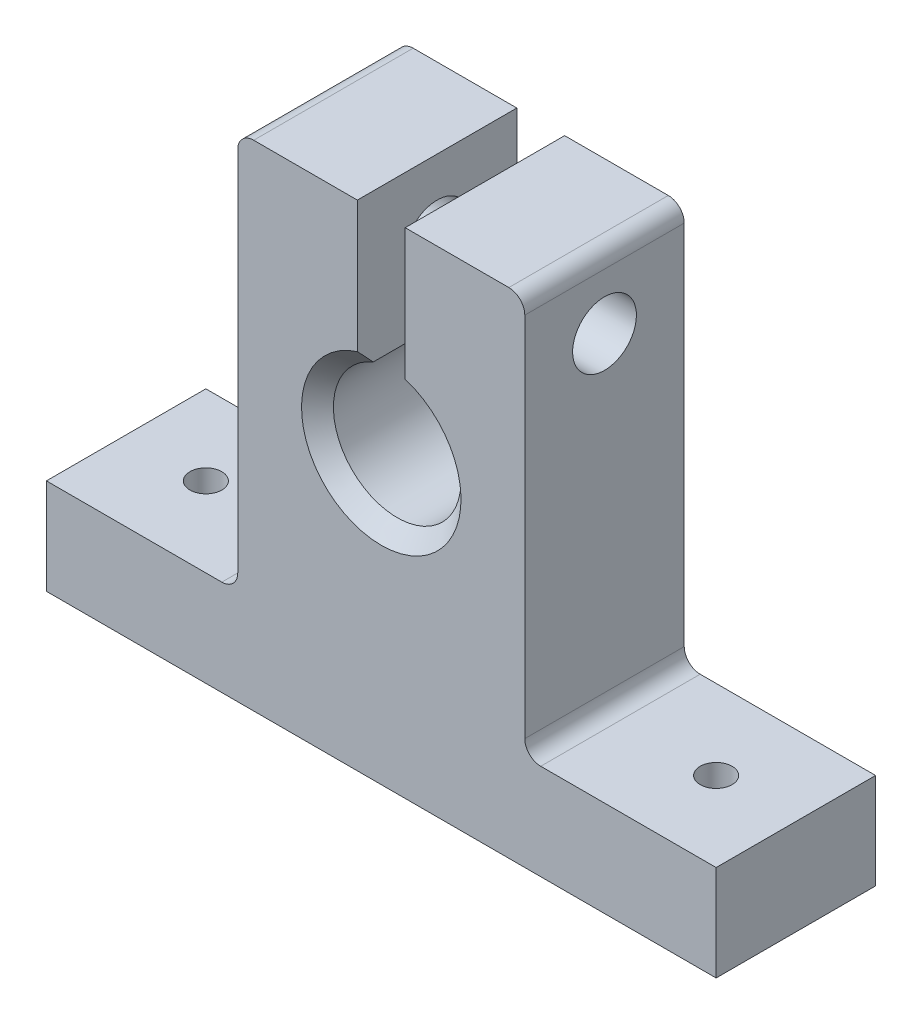
ISO-10303-21;
HEADER;
FILE_DESCRIPTION(('STEP AP214'),'2;1');
FILE_NAME('part.step','',(''),(''),'','','');
FILE_SCHEMA(('AUTOMOTIVE_DESIGN { 1 0 10303 214 1 1 1 1 }'));
ENDSEC;
DATA;
#1=APPLICATION_CONTEXT('core data for automotive mechanical design processes');
#2=APPLICATION_PROTOCOL_DEFINITION('international standard','automotive_design',2000,#1);
#3=PRODUCT_CONTEXT('',#1,'mechanical');
#4=PRODUCT('Part','Part','',(#3));
#5=PRODUCT_RELATED_PRODUCT_CATEGORY('part','',(#4));
#6=PRODUCT_DEFINITION_FORMATION('','',#4);
#7=PRODUCT_DEFINITION_CONTEXT('part definition',#1,'design');
#8=PRODUCT_DEFINITION('design','',#6,#7);
#9=PRODUCT_DEFINITION_SHAPE('','',#8);
#10=(LENGTH_UNIT() NAMED_UNIT(*) SI_UNIT(.MILLI.,.METRE.));
#11=(NAMED_UNIT(*) PLANE_ANGLE_UNIT() SI_UNIT($,.RADIAN.));
#12=(NAMED_UNIT(*) SI_UNIT($,.STERADIAN.) SOLID_ANGLE_UNIT());
#13=UNCERTAINTY_MEASURE_WITH_UNIT(LENGTH_MEASURE(1.E-05),#10,'distance_accuracy_value','');
#14=(GEOMETRIC_REPRESENTATION_CONTEXT(3) GLOBAL_UNCERTAINTY_ASSIGNED_CONTEXT((#13)) GLOBAL_UNIT_ASSIGNED_CONTEXT((#10,
#11,#12)) REPRESENTATION_CONTEXT('',''));
#15=CARTESIAN_POINT('',(0.,0.,0.));
#16=DIRECTION('',(0.,0.,1.));
#17=DIRECTION('',(1.,0.,0.));
#18=AXIS2_PLACEMENT_3D('',#15,#16,#17);
#19=CARTESIAN_POINT('',(0.,28.,0.));
#20=DIRECTION('',(0.,1.,0.));
#21=DIRECTION('',(0.,0.,1.));
#22=AXIS2_PLACEMENT_3D('',#19,#20,#21);
#23=PLANE('',#22);
#24=DIRECTION('',(0.,0.,1.));
#25=VECTOR('',#24,1.);
#26=CARTESIAN_POINT('',(8.,28.,0.));
#27=LINE('',#26,#25);
#28=CARTESIAN_POINT('',(8.,28.,12.));
#29=VERTEX_POINT('',#28);
#30=CARTESIAN_POINT('',(8.,28.,2.));
#31=VERTEX_POINT('',#30);
#32=EDGE_CURVE('E178',#29,#31,#27,.F.);
#33=ORIENTED_EDGE('',*,*,#32,.T.);
#34=DIRECTION('',(-1.,0.,0.));
#35=VECTOR('',#34,1.);
#36=CARTESIAN_POINT('',(0.,28.,2.));
#37=LINE('',#36,#35);
#38=CARTESIAN_POINT('',(1.5,28.,2.));
#39=VERTEX_POINT('',#38);
#40=EDGE_CURVE('E164',#31,#39,#37,.T.);
#41=ORIENTED_EDGE('',*,*,#40,.T.);
#42=DIRECTION('',(0.,0.,1.));
#43=VECTOR('',#42,1.);
#44=CARTESIAN_POINT('',(1.5,28.,0.));
#45=LINE('',#44,#43);
#46=CARTESIAN_POINT('',(1.5,28.,12.));
#47=VERTEX_POINT('',#46);
#48=EDGE_CURVE('E175',#39,#47,#45,.T.);
#49=ORIENTED_EDGE('',*,*,#48,.T.);
#50=DIRECTION('',(1.,0.,0.));
#51=VECTOR('',#50,1.);
#52=CARTESIAN_POINT('',(0.,28.,12.));
#53=LINE('',#52,#51);
#54=EDGE_CURVE('E401',#47,#29,#53,.T.);
#55=ORIENTED_EDGE('',*,*,#54,.T.);
#56=EDGE_LOOP('',(#33,#41,#49,#55));
#57=FACE_BOUND('',#56,.T.);
#58=ADVANCED_FACE('F33',(#57),#23,.T.);
#59=CARTESIAN_POINT('',(-21.,3.,14.));
#60=DIRECTION('',(0.,-1.,0.));
#61=DIRECTION('',(0.,0.,-1.));
#62=AXIS2_PLACEMENT_3D('',#59,#60,#61);
#63=PLANE('',#62);
#64=CARTESIAN_POINT('',(-16.,3.,7.));
#65=DIRECTION('',(0.,-1.,0.));
#66=DIRECTION('',(0.,0.,-1.));
#67=AXIS2_PLACEMENT_3D('',#64,#65,#66);
#68=CIRCLE('',#67,1.);
#69=CARTESIAN_POINT('',(-16.,3.,6.));
#70=VERTEX_POINT('',#69);
#71=EDGE_CURVE('E205',#70,#70,#68,.T.);
#72=ORIENTED_EDGE('',*,*,#71,.T.);
#73=EDGE_LOOP('',(#72));
#74=FACE_BOUND('',#73,.T.);
#75=DIRECTION('',(1.,0.,0.));
#76=VECTOR('',#75,1.);
#77=CARTESIAN_POINT('',(-21.,3.,2.));
#78=LINE('',#77,#76);
#79=CARTESIAN_POINT('',(-21.,3.,2.));
#80=VERTEX_POINT('',#79);
#81=CARTESIAN_POINT('',(-10.,3.,2.));
#82=VERTEX_POINT('',#81);
#83=EDGE_CURVE('E399',#80,#82,#78,.T.);
#84=ORIENTED_EDGE('',*,*,#83,.F.);
#85=DIRECTION('',(0.,0.,-1.));
#86=VECTOR('',#85,1.);
#87=CARTESIAN_POINT('',(-21.,3.,14.));
#88=LINE('',#87,#86);
#89=CARTESIAN_POINT('',(-21.,3.,12.));
#90=VERTEX_POINT('',#89);
#91=EDGE_CURVE('E214',#90,#80,#88,.T.);
#92=ORIENTED_EDGE('',*,*,#91,.F.);
#93=DIRECTION('',(-1.,0.,0.));
#94=VECTOR('',#93,1.);
#95=CARTESIAN_POINT('',(-21.,3.,12.));
#96=LINE('',#95,#94);
#97=CARTESIAN_POINT('',(-10.,3.,12.));
#98=VERTEX_POINT('',#97);
#99=EDGE_CURVE('E361',#98,#90,#96,.T.);
#100=ORIENTED_EDGE('',*,*,#99,.F.);
#101=DIRECTION('',(0.,0.,1.));
#102=VECTOR('',#101,1.);
#103=CARTESIAN_POINT('',(-10.,3.,14.));
#104=LINE('',#103,#102);
#105=EDGE_CURVE('E222',#98,#82,#104,.F.);
#106=ORIENTED_EDGE('',*,*,#105,.T.);
#107=EDGE_LOOP('',(#84,#92,#100,#106));
#108=FACE_BOUND('',#107,.T.);
#109=ADVANCED_FACE('F292',(#74,#108),#63,.F.);
#110=CARTESIAN_POINT('',(21.,-3.,14.));
#111=DIRECTION('',(-1.,0.,0.));
#112=DIRECTION('',(0.,0.,1.));
#113=AXIS2_PLACEMENT_3D('',#110,#111,#112);
#114=PLANE('',#113);
#115=DIRECTION('',(0.,-1.,0.));
#116=VECTOR('',#115,1.);
#117=CARTESIAN_POINT('',(21.,-3.,2.));
#118=LINE('',#117,#116);
#119=CARTESIAN_POINT('',(21.,3.,2.));
#120=VERTEX_POINT('',#119);
#121=CARTESIAN_POINT('',(21.,-3.,2.));
#122=VERTEX_POINT('',#121);
#123=EDGE_CURVE('E391',#120,#122,#118,.T.);
#124=ORIENTED_EDGE('',*,*,#123,.F.);
#125=DIRECTION('',(0.,0.,-1.));
#126=VECTOR('',#125,1.);
#127=CARTESIAN_POINT('',(21.,3.,14.));
#128=LINE('',#127,#126);
#129=CARTESIAN_POINT('',(21.,3.,12.));
#130=VERTEX_POINT('',#129);
#131=EDGE_CURVE('E217',#130,#120,#128,.T.);
#132=ORIENTED_EDGE('',*,*,#131,.F.);
#133=DIRECTION('',(0.,1.,0.));
#134=VECTOR('',#133,1.);
#135=CARTESIAN_POINT('',(21.,-3.,12.));
#136=LINE('',#135,#134);
#137=CARTESIAN_POINT('',(21.,-3.,12.));
#138=VERTEX_POINT('',#137);
#139=EDGE_CURVE('E353',#138,#130,#136,.T.);
#140=ORIENTED_EDGE('',*,*,#139,.F.);
#141=DIRECTION('',(0.,0.,-1.));
#142=VECTOR('',#141,1.);
#143=CARTESIAN_POINT('',(21.,-3.,14.));
#144=LINE('',#143,#142);
#145=EDGE_CURVE('E208',#138,#122,#144,.T.);
#146=ORIENTED_EDGE('',*,*,#145,.T.);
#147=EDGE_LOOP('',(#124,#132,#140,#146));
#148=FACE_BOUND('',#147,.T.);
#149=ADVANCED_FACE('F303',(#148),#114,.F.);
#150=CARTESIAN_POINT('',(16.,3.,7.));
#151=DIRECTION('',(0.,-1.,0.));
#152=DIRECTION('',(0.,0.,-1.));
#153=AXIS2_PLACEMENT_3D('',#150,#151,#152);
#154=CIRCLE('',#153,1.);
#155=CARTESIAN_POINT('',(16.,3.,6.));
#156=VERTEX_POINT('',#155);
#157=EDGE_CURVE('E188',#156,#156,#154,.T.);
#158=ORIENTED_EDGE('',*,*,#157,.T.);
#159=EDGE_LOOP('',(#158));
#160=FACE_BOUND('',#159,.T.);
#161=DIRECTION('',(1.,0.,0.));
#162=VECTOR('',#161,1.);
#163=CARTESIAN_POINT('',(-21.,3.,2.));
#164=LINE('',#163,#162);
#165=CARTESIAN_POINT('',(10.,3.,2.));
#166=VERTEX_POINT('',#165);
#167=EDGE_CURVE('E389',#166,#120,#164,.T.);
#168=ORIENTED_EDGE('',*,*,#167,.F.);
#169=DIRECTION('',(0.,0.,1.));
#170=VECTOR('',#169,1.);
#171=CARTESIAN_POINT('',(10.,3.,14.));
#172=LINE('',#171,#170);
#173=CARTESIAN_POINT('',(9.99999999999999,3.,12.));
#174=VERTEX_POINT('',#173);
#175=EDGE_CURVE('E225',#166,#174,#172,.T.);
#176=ORIENTED_EDGE('',*,*,#175,.T.);
#177=DIRECTION('',(-1.,0.,0.));
#178=VECTOR('',#177,1.);
#179=CARTESIAN_POINT('',(-21.,3.,12.));
#180=LINE('',#179,#178);
#181=EDGE_CURVE('E351',#130,#174,#180,.T.);
#182=ORIENTED_EDGE('',*,*,#181,.F.);
#183=ORIENTED_EDGE('',*,*,#131,.T.);
#184=EDGE_LOOP('',(#168,#176,#182,#183));
#185=FACE_BOUND('',#184,.T.);
#186=ADVANCED_FACE('F299',(#160,#185),#63,.F.);
#187=CARTESIAN_POINT('',(-21.,-3.,14.));
#188=DIRECTION('',(1.,0.,0.));
#189=DIRECTION('',(0.,0.,-1.));
#190=AXIS2_PLACEMENT_3D('',#187,#188,#189);
#191=PLANE('',#190);
#192=DIRECTION('',(0.,1.,0.));
#193=VECTOR('',#192,1.);
#194=CARTESIAN_POINT('',(-21.,-3.,2.));
#195=LINE('',#194,#193);
#196=CARTESIAN_POINT('',(-21.,-3.,2.));
#197=VERTEX_POINT('',#196);
#198=EDGE_CURVE('E397',#197,#80,#195,.T.);
#199=ORIENTED_EDGE('',*,*,#198,.F.);
#200=DIRECTION('',(0.,0.,-1.));
#201=VECTOR('',#200,1.);
#202=CARTESIAN_POINT('',(-21.,-3.,14.));
#203=LINE('',#202,#201);
#204=CARTESIAN_POINT('',(-21.,-3.,12.));
#205=VERTEX_POINT('',#204);
#206=EDGE_CURVE('E211',#205,#197,#203,.T.);
#207=ORIENTED_EDGE('',*,*,#206,.F.);
#208=DIRECTION('',(0.,-1.,0.));
#209=VECTOR('',#208,1.);
#210=CARTESIAN_POINT('',(-21.,-3.,12.));
#211=LINE('',#210,#209);
#212=EDGE_CURVE('E359',#90,#205,#211,.T.);
#213=ORIENTED_EDGE('',*,*,#212,.F.);
#214=ORIENTED_EDGE('',*,*,#91,.T.);
#215=EDGE_LOOP('',(#199,#207,#213,#214));
#216=FACE_BOUND('',#215,.T.);
#217=ADVANCED_FACE('F295',(#216),#191,.F.);
#218=CARTESIAN_POINT('',(-21.,-3.,14.));
#219=DIRECTION('',(0.,1.,0.));
#220=DIRECTION('',(0.,0.,1.));
#221=AXIS2_PLACEMENT_3D('',#218,#219,#220);
#222=PLANE('',#221);
#223=CARTESIAN_POINT('',(16.,-3.,7.));
#224=DIRECTION('',(0.,-1.,0.));
#225=DIRECTION('',(0.,0.,-1.));
#226=AXIS2_PLACEMENT_3D('',#223,#224,#225);
#227=CIRCLE('',#226,1.);
#228=CARTESIAN_POINT('',(16.,-3.,6.));
#229=VERTEX_POINT('',#228);
#230=EDGE_CURVE('E184',#229,#229,#227,.T.);
#231=ORIENTED_EDGE('',*,*,#230,.F.);
#232=EDGE_LOOP('',(#231));
#233=FACE_BOUND('',#232,.T.);
#234=CARTESIAN_POINT('',(-16.,-3.,7.));
#235=DIRECTION('',(0.,-1.,0.));
#236=DIRECTION('',(0.,0.,-1.));
#237=AXIS2_PLACEMENT_3D('',#234,#235,#236);
#238=CIRCLE('',#237,1.);
#239=CARTESIAN_POINT('',(-16.,-3.,6.));
#240=VERTEX_POINT('',#239);
#241=EDGE_CURVE('E202',#240,#240,#238,.T.);
#242=ORIENTED_EDGE('',*,*,#241,.F.);
#243=EDGE_LOOP('',(#242));
#244=FACE_BOUND('',#243,.T.);
#245=DIRECTION('',(-1.,0.,0.));
#246=VECTOR('',#245,1.);
#247=CARTESIAN_POINT('',(-21.,-3.,2.));
#248=LINE('',#247,#246);
#249=EDGE_CURVE('E395',#122,#197,#248,.T.);
#250=ORIENTED_EDGE('',*,*,#249,.F.);
#251=ORIENTED_EDGE('',*,*,#145,.F.);
#252=DIRECTION('',(1.,0.,0.));
#253=VECTOR('',#252,1.);
#254=CARTESIAN_POINT('',(-21.,-3.,12.));
#255=LINE('',#254,#253);
#256=EDGE_CURVE('E357',#205,#138,#255,.T.);
#257=ORIENTED_EDGE('',*,*,#256,.F.);
#258=ORIENTED_EDGE('',*,*,#206,.T.);
#259=EDGE_LOOP('',(#250,#251,#257,#258));
#260=FACE_BOUND('',#259,.T.);
#261=ADVANCED_FACE('F285',(#233,#244,#260),#222,.F.);
#262=CARTESIAN_POINT('',(9.,28.,0.));
#263=DIRECTION('',(1.,0.,0.));
#264=DIRECTION('',(0.,1.,0.));
#265=AXIS2_PLACEMENT_3D('',#262,#263,#264);
#266=PLANE('',#265);
#267=CARTESIAN_POINT('',(9.,23.5,7.));
#268=DIRECTION('',(1.,0.,0.));
#269=DIRECTION('',(0.,1.,0.));
#270=AXIS2_PLACEMENT_3D('',#267,#268,#269);
#271=CIRCLE('',#270,2.);
#272=CARTESIAN_POINT('',(9.,25.5,7.));
#273=VERTEX_POINT('',#272);
#274=EDGE_CURVE('E242',#273,#273,#271,.T.);
#275=ORIENTED_EDGE('',*,*,#274,.F.);
#276=EDGE_LOOP('',(#275));
#277=FACE_BOUND('',#276,.T.);
#278=DIRECTION('',(0.,0.,1.));
#279=VECTOR('',#278,1.);
#280=CARTESIAN_POINT('',(9.,4.,0.));
#281=LINE('',#280,#279);
#282=CARTESIAN_POINT('',(9.,4.,12.));
#283=VERTEX_POINT('',#282);
#284=CARTESIAN_POINT('',(9.,4.,2.));
#285=VERTEX_POINT('',#284);
#286=EDGE_CURVE('E227',#283,#285,#281,.F.);
#287=ORIENTED_EDGE('',*,*,#286,.T.);
#288=DIRECTION('',(0.,1.,0.));
#289=VECTOR('',#288,1.);
#290=CARTESIAN_POINT('',(9.,28.,2.));
#291=LINE('',#290,#289);
#292=CARTESIAN_POINT('',(9.,27.,2.));
#293=VERTEX_POINT('',#292);
#294=EDGE_CURVE('E332',#285,#293,#291,.T.);
#295=ORIENTED_EDGE('',*,*,#294,.T.);
#296=DIRECTION('',(0.,0.,1.));
#297=VECTOR('',#296,1.);
#298=CARTESIAN_POINT('',(9.,27.,0.));
#299=LINE('',#298,#297);
#300=CARTESIAN_POINT('',(9.,27.,12.));
#301=VERTEX_POINT('',#300);
#302=EDGE_CURVE('E235',#293,#301,#299,.T.);
#303=ORIENTED_EDGE('',*,*,#302,.T.);
#304=DIRECTION('',(0.,-1.,0.));
#305=VECTOR('',#304,1.);
#306=CARTESIAN_POINT('',(9.,28.,12.));
#307=LINE('',#306,#305);
#308=EDGE_CURVE('E330',#301,#283,#307,.T.);
#309=ORIENTED_EDGE('',*,*,#308,.T.);
#310=EDGE_LOOP('',(#287,#295,#303,#309));
#311=FACE_BOUND('',#310,.T.);
#312=ADVANCED_FACE('F281',(#277,#311),#266,.T.);
#313=CARTESIAN_POINT('',(-9.,28.,0.));
#314=DIRECTION('',(-1.,0.,0.));
#315=DIRECTION('',(0.,-1.,0.));
#316=AXIS2_PLACEMENT_3D('',#313,#314,#315);
#317=PLANE('',#316);
#318=CARTESIAN_POINT('',(-9.,23.5,7.));
#319=DIRECTION('',(-1.,0.,0.));
#320=DIRECTION('',(0.,-1.,0.));
#321=AXIS2_PLACEMENT_3D('',#318,#319,#320);
#322=CIRCLE('',#321,2.);
#323=CARTESIAN_POINT('',(-9.,21.5,7.));
#324=VERTEX_POINT('',#323);
#325=EDGE_CURVE('E193',#324,#324,#322,.T.);
#326=ORIENTED_EDGE('',*,*,#325,.F.);
#327=EDGE_LOOP('',(#326));
#328=FACE_BOUND('',#327,.T.);
#329=DIRECTION('',(0.,0.,1.));
#330=VECTOR('',#329,1.);
#331=CARTESIAN_POINT('',(-9.,27.,0.));
#332=LINE('',#331,#330);
#333=CARTESIAN_POINT('',(-9.,27.,12.));
#334=VERTEX_POINT('',#333);
#335=CARTESIAN_POINT('',(-9.,27.,2.));
#336=VERTEX_POINT('',#335);
#337=EDGE_CURVE('E232',#334,#336,#332,.F.);
#338=ORIENTED_EDGE('',*,*,#337,.T.);
#339=DIRECTION('',(0.,-1.,0.));
#340=VECTOR('',#339,1.);
#341=CARTESIAN_POINT('',(-9.,28.,2.));
#342=LINE('',#341,#340);
#343=CARTESIAN_POINT('',(-9.,4.,2.));
#344=VERTEX_POINT('',#343);
#345=EDGE_CURVE('E374',#336,#344,#342,.T.);
#346=ORIENTED_EDGE('',*,*,#345,.T.);
#347=DIRECTION('',(0.,0.,1.));
#348=VECTOR('',#347,1.);
#349=CARTESIAN_POINT('',(-9.,4.,0.));
#350=LINE('',#349,#348);
#351=CARTESIAN_POINT('',(-9.,4.,12.));
#352=VERTEX_POINT('',#351);
#353=EDGE_CURVE('E220',#344,#352,#350,.T.);
#354=ORIENTED_EDGE('',*,*,#353,.T.);
#355=DIRECTION('',(0.,1.,0.));
#356=VECTOR('',#355,1.);
#357=CARTESIAN_POINT('',(-9.,28.,12.));
#358=LINE('',#357,#356);
#359=EDGE_CURVE('E348',#352,#334,#358,.T.);
#360=ORIENTED_EDGE('',*,*,#359,.T.);
#361=EDGE_LOOP('',(#338,#346,#354,#360));
#362=FACE_BOUND('',#361,.T.);
#363=ADVANCED_FACE('F284',(#328,#362),#317,.T.);
#364=DIRECTION('',(0.,0.,1.));
#365=VECTOR('',#364,1.);
#366=CARTESIAN_POINT('',(-1.5,28.,0.));
#367=LINE('',#366,#365);
#368=CARTESIAN_POINT('',(-1.5,28.,2.));
#369=VERTEX_POINT('',#368);
#370=CARTESIAN_POINT('',(-1.5,28.,12.));
#371=VERTEX_POINT('',#370);
#372=EDGE_CURVE('E197',#369,#371,#367,.T.);
#373=ORIENTED_EDGE('',*,*,#372,.F.);
#374=DIRECTION('',(-1.,0.,0.));
#375=VECTOR('',#374,1.);
#376=CARTESIAN_POINT('',(0.,28.,2.));
#377=LINE('',#376,#375);
#378=CARTESIAN_POINT('',(-8.,28.,2.));
#379=VERTEX_POINT('',#378);
#380=EDGE_CURVE('E384',#369,#379,#377,.T.);
#381=ORIENTED_EDGE('',*,*,#380,.T.);
#382=DIRECTION('',(0.,0.,1.));
#383=VECTOR('',#382,1.);
#384=CARTESIAN_POINT('',(-8.,28.,0.));
#385=LINE('',#384,#383);
#386=CARTESIAN_POINT('',(-8.,28.,12.));
#387=VERTEX_POINT('',#386);
#388=EDGE_CURVE('E230',#379,#387,#385,.T.);
#389=ORIENTED_EDGE('',*,*,#388,.T.);
#390=DIRECTION('',(1.,0.,0.));
#391=VECTOR('',#390,1.);
#392=CARTESIAN_POINT('',(0.,28.,12.));
#393=LINE('',#392,#391);
#394=EDGE_CURVE('E339',#387,#371,#393,.T.);
#395=ORIENTED_EDGE('',*,*,#394,.T.);
#396=EDGE_LOOP('',(#373,#381,#389,#395));
#397=FACE_BOUND('',#396,.T.);
#398=ADVANCED_FACE('F280',(#397),#23,.T.);
#399=CARTESIAN_POINT('',(0.,15.,0.));
#400=DIRECTION('',(0.,0.,1.));
#401=DIRECTION('',(1.,0.,0.));
#402=AXIS2_PLACEMENT_3D('',#399,#400,#401);
#403=CYLINDRICAL_SURFACE('',#402,4.);
#404=DIRECTION('',(0.,0.,1.));
#405=VECTOR('',#404,1.);
#406=CARTESIAN_POINT('',(1.5,18.7080992435478,0.));
#407=LINE('',#406,#405);
#408=CARTESIAN_POINT('',(1.5,18.7080992435478,3.));
#409=VERTEX_POINT('',#408);
#410=CARTESIAN_POINT('',(1.5,18.7080992435478,11.));
#411=VERTEX_POINT('',#410);
#412=EDGE_CURVE('E185',#409,#411,#407,.T.);
#413=ORIENTED_EDGE('',*,*,#412,.F.);
#414=CARTESIAN_POINT('',(0.,15.,3.));
#415=DIRECTION('',(0.,0.,-1.));
#416=DIRECTION('',(-1.,0.,0.));
#417=AXIS2_PLACEMENT_3D('',#414,#415,#416);
#418=CIRCLE('',#417,4.);
#419=CARTESIAN_POINT('',(-1.5,18.7080992435478,3.));
#420=VERTEX_POINT('',#419);
#421=EDGE_CURVE('E46',#409,#420,#418,.T.);
#422=ORIENTED_EDGE('',*,*,#421,.T.);
#423=DIRECTION('',(0.,0.,1.));
#424=VECTOR('',#423,1.);
#425=CARTESIAN_POINT('',(-1.5,18.7080992435478,0.));
#426=LINE('',#425,#424);
#427=CARTESIAN_POINT('',(-1.5,18.7080992435478,11.));
#428=VERTEX_POINT('',#427);
#429=EDGE_CURVE('E190',#420,#428,#426,.T.);
#430=ORIENTED_EDGE('',*,*,#429,.T.);
#431=CARTESIAN_POINT('',(0.,15.,11.));
#432=DIRECTION('',(0.,0.,1.));
#433=DIRECTION('',(1.,0.,0.));
#434=AXIS2_PLACEMENT_3D('',#431,#432,#433);
#435=CIRCLE('',#434,4.);
#436=EDGE_CURVE('E252',#428,#411,#435,.T.);
#437=ORIENTED_EDGE('',*,*,#436,.T.);
#438=EDGE_LOOP('',(#413,#422,#430,#437));
#439=FACE_BOUND('',#438,.T.);
#440=ADVANCED_FACE('F276',(#439),#403,.F.);
#441=CARTESIAN_POINT('',(-10.,4.,0.));
#442=DIRECTION('',(0.,0.,1.));
#443=DIRECTION('',(1.,0.,0.));
#444=AXIS2_PLACEMENT_3D('',#441,#442,#443);
#445=CYLINDRICAL_SURFACE('',#444,1.);
#446=CARTESIAN_POINT('',(-10.,4.,2.));
#447=DIRECTION('',(0.,0.,-1.));
#448=DIRECTION('',(-1.,0.,0.));
#449=AXIS2_PLACEMENT_3D('',#446,#447,#448);
#450=CIRCLE('',#449,1.);
#451=EDGE_CURVE('E393',#82,#344,#450,.F.);
#452=ORIENTED_EDGE('',*,*,#451,.F.);
#453=ORIENTED_EDGE('',*,*,#105,.F.);
#454=CARTESIAN_POINT('',(-10.,4.,12.));
#455=DIRECTION('',(0.,0.,1.));
#456=DIRECTION('',(1.,0.,0.));
#457=AXIS2_PLACEMENT_3D('',#454,#455,#456);
#458=CIRCLE('',#457,1.);
#459=EDGE_CURVE('E355',#352,#98,#458,.F.);
#460=ORIENTED_EDGE('',*,*,#459,.F.);
#461=ORIENTED_EDGE('',*,*,#353,.F.);
#462=EDGE_LOOP('',(#452,#453,#460,#461));
#463=FACE_BOUND('',#462,.T.);
#464=ADVANCED_FACE('F279',(#463),#445,.F.);
#465=CARTESIAN_POINT('',(10.,4.,14.));
#466=DIRECTION('',(0.,0.,1.));
#467=DIRECTION('',(1.,0.,0.));
#468=AXIS2_PLACEMENT_3D('',#465,#466,#467);
#469=CYLINDRICAL_SURFACE('',#468,1.);
#470=CARTESIAN_POINT('',(10.,4.,2.));
#471=DIRECTION('',(0.,0.,-1.));
#472=DIRECTION('',(-1.,0.,0.));
#473=AXIS2_PLACEMENT_3D('',#470,#471,#472);
#474=CIRCLE('',#473,1.);
#475=EDGE_CURVE('E381',#285,#166,#474,.F.);
#476=ORIENTED_EDGE('',*,*,#475,.F.);
#477=ORIENTED_EDGE('',*,*,#286,.F.);
#478=CARTESIAN_POINT('',(10.,4.,12.));
#479=DIRECTION('',(0.,0.,1.));
#480=DIRECTION('',(1.,0.,0.));
#481=AXIS2_PLACEMENT_3D('',#478,#479,#480);
#482=CIRCLE('',#481,1.);
#483=EDGE_CURVE('E337',#174,#283,#482,.F.);
#484=ORIENTED_EDGE('',*,*,#483,.F.);
#485=ORIENTED_EDGE('',*,*,#175,.F.);
#486=EDGE_LOOP('',(#476,#477,#484,#485));
#487=FACE_BOUND('',#486,.T.);
#488=ADVANCED_FACE('F310',(#487),#469,.F.);
#489=CARTESIAN_POINT('',(-8.,27.,0.));
#490=DIRECTION('',(0.,0.,1.));
#491=DIRECTION('',(1.,0.,0.));
#492=AXIS2_PLACEMENT_3D('',#489,#490,#491);
#493=CYLINDRICAL_SURFACE('',#492,1.);
#494=ORIENTED_EDGE('',*,*,#388,.F.);
#495=CARTESIAN_POINT('',(-8.,27.,2.));
#496=DIRECTION('',(0.,0.,-1.));
#497=DIRECTION('',(-1.,0.,0.));
#498=AXIS2_PLACEMENT_3D('',#495,#496,#497);
#499=CIRCLE('',#498,1.);
#500=EDGE_CURVE('E379',#379,#336,#499,.F.);
#501=ORIENTED_EDGE('',*,*,#500,.T.);
#502=ORIENTED_EDGE('',*,*,#337,.F.);
#503=CARTESIAN_POINT('',(-8.,27.,12.));
#504=DIRECTION('',(0.,0.,1.));
#505=DIRECTION('',(1.,0.,0.));
#506=AXIS2_PLACEMENT_3D('',#503,#504,#505);
#507=CIRCLE('',#506,1.);
#508=EDGE_CURVE('E338',#334,#387,#507,.F.);
#509=ORIENTED_EDGE('',*,*,#508,.T.);
#510=EDGE_LOOP('',(#494,#501,#502,#509));
#511=FACE_BOUND('',#510,.T.);
#512=ADVANCED_FACE('F314',(#511),#493,.T.);
#513=CARTESIAN_POINT('',(8.,27.,0.));
#514=DIRECTION('',(0.,0.,1.));
#515=DIRECTION('',(1.,0.,0.));
#516=AXIS2_PLACEMENT_3D('',#513,#514,#515);
#517=CYLINDRICAL_SURFACE('',#516,1.);
#518=ORIENTED_EDGE('',*,*,#302,.F.);
#519=CARTESIAN_POINT('',(8.,27.,2.));
#520=DIRECTION('',(0.,0.,-1.));
#521=DIRECTION('',(-1.,0.,0.));
#522=AXIS2_PLACEMENT_3D('',#519,#520,#521);
#523=CIRCLE('',#522,1.);
#524=EDGE_CURVE('E324',#293,#31,#523,.F.);
#525=ORIENTED_EDGE('',*,*,#524,.T.);
#526=ORIENTED_EDGE('',*,*,#32,.F.);
#527=CARTESIAN_POINT('',(8.,27.,12.));
#528=DIRECTION('',(0.,0.,1.));
#529=DIRECTION('',(1.,0.,0.));
#530=AXIS2_PLACEMENT_3D('',#527,#528,#529);
#531=CIRCLE('',#530,1.);
#532=EDGE_CURVE('E325',#29,#301,#531,.F.);
#533=ORIENTED_EDGE('',*,*,#532,.T.);
#534=EDGE_LOOP('',(#518,#525,#526,#533));
#535=FACE_BOUND('',#534,.T.);
#536=ADVANCED_FACE('F262',(#535),#517,.T.);
#537=CARTESIAN_POINT('',(-1.5,28.,0.));
#538=DIRECTION('',(-1.,0.,0.));
#539=DIRECTION('',(0.,-1.,0.));
#540=AXIS2_PLACEMENT_3D('',#537,#538,#539);
#541=PLANE('',#540);
#542=CARTESIAN_POINT('',(-1.5,23.5,7.));
#543=DIRECTION('',(-1.,0.,0.));
#544=DIRECTION('',(0.,-1.,0.));
#545=AXIS2_PLACEMENT_3D('',#542,#543,#544);
#546=CIRCLE('',#545,2.);
#547=CARTESIAN_POINT('',(-1.5,21.5,7.));
#548=VERTEX_POINT('',#547);
#549=EDGE_CURVE('E241',#548,#548,#546,.T.);
#550=ORIENTED_EDGE('',*,*,#549,.T.);
#551=EDGE_LOOP('',(#550));
#552=FACE_BOUND('',#551,.T.);
#553=ORIENTED_EDGE('',*,*,#429,.F.);
#554=CARTESIAN_POINT('',(-1.5,18.7080992435478,3.));
#555=CARTESIAN_POINT('',(-1.5,18.7972268186076,2.91737086178072));
#556=CARTESIAN_POINT('',(-1.5,18.8861509814006,2.83452292975663));
#557=CARTESIAN_POINT('',(-1.5,19.0636510034211,2.6684569105171));
#558=CARTESIAN_POINT('',(-1.5,19.152226866983,2.5852388279356));
#559=CARTESIAN_POINT('',(-1.5,19.3290906935,2.41849819448638));
#560=CARTESIAN_POINT('',(-1.5,19.4173786575621,2.33497564479179));
#561=CARTESIAN_POINT('',(-1.5,19.5937102906956,2.16767082744027));
#562=CARTESIAN_POINT('',(-1.5,19.6817539567126,2.08388855656358));
#563=CARTESIAN_POINT('',(-1.5,19.7696960070847,2.));
#564=B_SPLINE_CURVE_WITH_KNOTS('',3,(#554,#555,#556,#557,#558,#559,#560,#561,#562,#563),
.UNSPECIFIED.,.F.,.F.,(4,2,2,2,4),(0.,0.364610732428382,0.729216913039811,1.09382169027648,
1.45843100575826),.UNSPECIFIED.);
#565=CARTESIAN_POINT('',(-1.5,19.7696960070847,2.));
#566=VERTEX_POINT('',#565);
#567=EDGE_CURVE('E11',#420,#566,#564,.T.);
#568=ORIENTED_EDGE('',*,*,#567,.T.);
#569=DIRECTION('',(0.,-1.,0.));
#570=VECTOR('',#569,1.);
#571=CARTESIAN_POINT('',(-1.5,28.,2.));
#572=LINE('',#571,#570);
#573=EDGE_CURVE('E179',#369,#566,#572,.T.);
#574=ORIENTED_EDGE('',*,*,#573,.F.);
#575=ORIENTED_EDGE('',*,*,#372,.T.);
#576=DIRECTION('',(0.,1.,0.));
#577=VECTOR('',#576,1.);
#578=CARTESIAN_POINT('',(-1.5,28.,12.));
#579=LINE('',#578,#577);
#580=CARTESIAN_POINT('',(-1.5,19.7696960070847,12.));
#581=VERTEX_POINT('',#580);
#582=EDGE_CURVE('E403',#581,#371,#579,.T.);
#583=ORIENTED_EDGE('',*,*,#582,.F.);
#584=CARTESIAN_POINT('',(-1.5,19.7696960070847,12.));
#585=CARTESIAN_POINT('',(-1.5,19.6817539567126,11.9161114434364));
#586=CARTESIAN_POINT('',(-1.5,19.5937102906956,11.8323291725597));
#587=CARTESIAN_POINT('',(-1.5,19.4173786575621,11.6650243552082));
#588=CARTESIAN_POINT('',(-1.5,19.3290906935,11.5815018055136));
#589=CARTESIAN_POINT('',(-1.5,19.152226866983,11.4147611720644));
#590=CARTESIAN_POINT('',(-1.5,19.0636510034211,11.3315430894829));
#591=CARTESIAN_POINT('',(-1.5,18.8861509814006,11.1654770702434));
#592=CARTESIAN_POINT('',(-1.5,18.7972268186076,11.0826291382193));
#593=CARTESIAN_POINT('',(-1.5,18.7080992435478,11.));
#594=B_SPLINE_CURVE_WITH_KNOTS('',3,(#584,#585,#586,#587,#588,#589,#590,#591,#592,#593),
.UNSPECIFIED.,.F.,.F.,(4,2,2,2,4),(0.,0.364609315481779,0.729214092718445,1.09382027332987,
1.45843100575825),.UNSPECIFIED.);
#595=EDGE_CURVE('E246',#581,#428,#594,.T.);
#596=ORIENTED_EDGE('',*,*,#595,.T.);
#597=EDGE_LOOP('',(#553,#568,#574,#575,#583,#596));
#598=FACE_BOUND('',#597,.T.);
#599=ADVANCED_FACE('F257',(#552,#598),#541,.F.);
#600=CARTESIAN_POINT('',(1.5,28.,0.));
#601=DIRECTION('',(1.,0.,0.));
#602=DIRECTION('',(0.,1.,0.));
#603=AXIS2_PLACEMENT_3D('',#600,#601,#602);
#604=PLANE('',#603);
#605=CARTESIAN_POINT('',(1.5,23.5,7.));
#606=DIRECTION('',(1.,0.,0.));
#607=DIRECTION('',(0.,1.,0.));
#608=AXIS2_PLACEMENT_3D('',#605,#606,#607);
#609=CIRCLE('',#608,2.);
#610=CARTESIAN_POINT('',(1.5,25.5,7.));
#611=VERTEX_POINT('',#610);
#612=EDGE_CURVE('E238',#611,#611,#609,.T.);
#613=ORIENTED_EDGE('',*,*,#612,.T.);
#614=EDGE_LOOP('',(#613));
#615=FACE_BOUND('',#614,.T.);
#616=DIRECTION('',(0.,1.,0.));
#617=VECTOR('',#616,1.);
#618=CARTESIAN_POINT('',(1.5,28.,2.));
#619=LINE('',#618,#617);
#620=CARTESIAN_POINT('',(1.5,19.7696960070847,2.));
#621=VERTEX_POINT('',#620);
#622=EDGE_CURVE('E160',#621,#39,#619,.T.);
#623=ORIENTED_EDGE('',*,*,#622,.F.);
#624=CARTESIAN_POINT('',(1.5,19.7696960070847,2.));
#625=CARTESIAN_POINT('',(1.5,19.6817539567126,2.08388855656358));
#626=CARTESIAN_POINT('',(1.5,19.5937102906956,2.16767082744028));
#627=CARTESIAN_POINT('',(1.5,19.4173786575621,2.33497564479179));
#628=CARTESIAN_POINT('',(1.5,19.3290906935,2.41849819448638));
#629=CARTESIAN_POINT('',(1.5,19.152226866983,2.5852388279356));
#630=CARTESIAN_POINT('',(1.5,19.0636510034211,2.6684569105171));
#631=CARTESIAN_POINT('',(1.5,18.8861509814006,2.83452292975664));
#632=CARTESIAN_POINT('',(1.5,18.7972268186076,2.91737086178073));
#633=CARTESIAN_POINT('',(1.5,18.7080992435478,3.));
#634=B_SPLINE_CURVE_WITH_KNOTS('',3,(#624,#625,#626,#627,#628,#629,#630,#631,#632,#633),
.UNSPECIFIED.,.F.,.F.,(4,2,2,2,4),(0.,0.364609315481783,0.72921409271845,1.09382027332988,
1.45843100575826),.UNSPECIFIED.);
#635=EDGE_CURVE('E60',#621,#409,#634,.T.);
#636=ORIENTED_EDGE('',*,*,#635,.T.);
#637=ORIENTED_EDGE('',*,*,#412,.T.);
#638=CARTESIAN_POINT('',(1.5,18.7080992435478,11.));
#639=CARTESIAN_POINT('',(1.5,18.7972268186076,11.0826291382193));
#640=CARTESIAN_POINT('',(1.5,18.8861509814006,11.1654770702434));
#641=CARTESIAN_POINT('',(1.5,19.0636510034211,11.3315430894829));
#642=CARTESIAN_POINT('',(1.5,19.152226866983,11.4147611720644));
#643=CARTESIAN_POINT('',(1.5,19.3290906935,11.5815018055136));
#644=CARTESIAN_POINT('',(1.5,19.4173786575621,11.6650243552082));
#645=CARTESIAN_POINT('',(1.5,19.5937102906956,11.8323291725597));
#646=CARTESIAN_POINT('',(1.5,19.6817539567126,11.9161114434364));
#647=CARTESIAN_POINT('',(1.5,19.7696960070847,12.));
#648=B_SPLINE_CURVE_WITH_KNOTS('',3,(#638,#639,#640,#641,#642,#643,#644,#645,#646,#647),
.UNSPECIFIED.,.F.,.F.,(4,2,2,2,4),(0.,0.364610732428383,0.729216913039811,1.09382169027647,
1.45843100575826),.UNSPECIFIED.);
#649=CARTESIAN_POINT('',(1.5,19.7696960070847,12.));
#650=VERTEX_POINT('',#649);
#651=EDGE_CURVE('E415',#411,#650,#648,.T.);
#652=ORIENTED_EDGE('',*,*,#651,.T.);
#653=DIRECTION('',(0.,-1.,0.));
#654=VECTOR('',#653,1.);
#655=CARTESIAN_POINT('',(1.5,28.,12.));
#656=LINE('',#655,#654);
#657=EDGE_CURVE('E170',#47,#650,#656,.T.);
#658=ORIENTED_EDGE('',*,*,#657,.F.);
#659=ORIENTED_EDGE('',*,*,#48,.F.);
#660=EDGE_LOOP('',(#623,#636,#637,#652,#658,#659));
#661=FACE_BOUND('',#660,.T.);
#662=ADVANCED_FACE('F182',(#615,#661),#604,.F.);
#663=CARTESIAN_POINT('',(-16.,11.,7.));
#664=DIRECTION('',(0.,-1.,0.));
#665=DIRECTION('',(0.,0.,-1.));
#666=AXIS2_PLACEMENT_3D('',#663,#664,#665);
#667=CYLINDRICAL_SURFACE('',#666,1.);
#668=ORIENTED_EDGE('',*,*,#241,.T.);
#669=EDGE_LOOP('',(#668));
#670=FACE_BOUND('',#669,.T.);
#671=ORIENTED_EDGE('',*,*,#71,.F.);
#672=EDGE_LOOP('',(#671));
#673=FACE_BOUND('',#672,.T.);
#674=ADVANCED_FACE('F271',(#670,#673),#667,.F.);
#675=CARTESIAN_POINT('',(16.,11.,7.));
#676=DIRECTION('',(0.,-1.,0.));
#677=DIRECTION('',(0.,0.,-1.));
#678=AXIS2_PLACEMENT_3D('',#675,#676,#677);
#679=CYLINDRICAL_SURFACE('',#678,1.);
#680=ORIENTED_EDGE('',*,*,#230,.T.);
#681=EDGE_LOOP('',(#680));
#682=FACE_BOUND('',#681,.T.);
#683=ORIENTED_EDGE('',*,*,#157,.F.);
#684=EDGE_LOOP('',(#683));
#685=FACE_BOUND('',#684,.T.);
#686=ADVANCED_FACE('F266',(#682,#685),#679,.F.);
#687=CARTESIAN_POINT('',(-15.,23.5,7.));
#688=DIRECTION('',(1.,0.,0.));
#689=DIRECTION('',(0.,1.,0.));
#690=AXIS2_PLACEMENT_3D('',#687,#688,#689);
#691=CYLINDRICAL_SURFACE('',#690,2.);
#692=ORIENTED_EDGE('',*,*,#274,.T.);
#693=EDGE_LOOP('',(#692));
#694=FACE_BOUND('',#693,.T.);
#695=ORIENTED_EDGE('',*,*,#612,.F.);
#696=EDGE_LOOP('',(#695));
#697=FACE_BOUND('',#696,.T.);
#698=ADVANCED_FACE('F270',(#694,#697),#691,.F.);
#699=ORIENTED_EDGE('',*,*,#325,.T.);
#700=EDGE_LOOP('',(#699));
#701=FACE_BOUND('',#700,.T.);
#702=ORIENTED_EDGE('',*,*,#549,.F.);
#703=EDGE_LOOP('',(#702));
#704=FACE_BOUND('',#703,.T.);
#705=ADVANCED_FACE('F369',(#701,#704),#691,.F.);
#706=CARTESIAN_POINT('',(0.,0.,12.));
#707=DIRECTION('',(0.,0.,1.));
#708=DIRECTION('',(1.,0.,0.));
#709=AXIS2_PLACEMENT_3D('',#706,#707,#708);
#710=PLANE('',#709);
#711=ORIENTED_EDGE('',*,*,#657,.T.);
#712=CARTESIAN_POINT('',(0.,15.,12.));
#713=DIRECTION('',(0.,0.,1.));
#714=DIRECTION('',(1.,0.,0.));
#715=AXIS2_PLACEMENT_3D('',#712,#713,#714);
#716=CIRCLE('',#715,5.);
#717=EDGE_CURVE('E169',#650,#581,#716,.F.);
#718=ORIENTED_EDGE('',*,*,#717,.T.);
#719=ORIENTED_EDGE('',*,*,#582,.T.);
#720=ORIENTED_EDGE('',*,*,#394,.F.);
#721=ORIENTED_EDGE('',*,*,#508,.F.);
#722=ORIENTED_EDGE('',*,*,#359,.F.);
#723=ORIENTED_EDGE('',*,*,#459,.T.);
#724=ORIENTED_EDGE('',*,*,#99,.T.);
#725=ORIENTED_EDGE('',*,*,#212,.T.);
#726=ORIENTED_EDGE('',*,*,#256,.T.);
#727=ORIENTED_EDGE('',*,*,#139,.T.);
#728=ORIENTED_EDGE('',*,*,#181,.T.);
#729=ORIENTED_EDGE('',*,*,#483,.T.);
#730=ORIENTED_EDGE('',*,*,#308,.F.);
#731=ORIENTED_EDGE('',*,*,#532,.F.);
#732=ORIENTED_EDGE('',*,*,#54,.F.);
#733=EDGE_LOOP('',(#711,#718,#719,#720,#721,#722,#723,#724,#725,#726,#727,#728,#729,#730,#731,#732));
#734=FACE_BOUND('',#733,.T.);
#735=ADVANCED_FACE('F334',(#734),#710,.T.);
#736=CARTESIAN_POINT('',(0.,0.,2.));
#737=DIRECTION('',(0.,0.,-1.));
#738=DIRECTION('',(-1.,0.,0.));
#739=AXIS2_PLACEMENT_3D('',#736,#737,#738);
#740=PLANE('',#739);
#741=ORIENTED_EDGE('',*,*,#573,.T.);
#742=CARTESIAN_POINT('',(0.,15.,2.));
#743=DIRECTION('',(0.,0.,-1.));
#744=DIRECTION('',(-1.,0.,0.));
#745=AXIS2_PLACEMENT_3D('',#742,#743,#744);
#746=CIRCLE('',#745,5.);
#747=EDGE_CURVE('E167',#566,#621,#746,.F.);
#748=ORIENTED_EDGE('',*,*,#747,.T.);
#749=ORIENTED_EDGE('',*,*,#622,.T.);
#750=ORIENTED_EDGE('',*,*,#40,.F.);
#751=ORIENTED_EDGE('',*,*,#524,.F.);
#752=ORIENTED_EDGE('',*,*,#294,.F.);
#753=ORIENTED_EDGE('',*,*,#475,.T.);
#754=ORIENTED_EDGE('',*,*,#167,.T.);
#755=ORIENTED_EDGE('',*,*,#123,.T.);
#756=ORIENTED_EDGE('',*,*,#249,.T.);
#757=ORIENTED_EDGE('',*,*,#198,.T.);
#758=ORIENTED_EDGE('',*,*,#83,.T.);
#759=ORIENTED_EDGE('',*,*,#451,.T.);
#760=ORIENTED_EDGE('',*,*,#345,.F.);
#761=ORIENTED_EDGE('',*,*,#500,.F.);
#762=ORIENTED_EDGE('',*,*,#380,.F.);
#763=EDGE_LOOP('',(#741,#748,#749,#750,#751,#752,#753,#754,#755,#756,#757,#758,#759,#760,#761,#762));
#764=FACE_BOUND('',#763,.T.);
#765=ADVANCED_FACE('F163',(#764),#740,.T.);
#766=CARTESIAN_POINT('',(0.,15.,12.));
#767=DIRECTION('',(0.,0.,1.));
#768=DIRECTION('',(1.,0.,0.));
#769=AXIS2_PLACEMENT_3D('',#766,#767,#768);
#770=CONICAL_SURFACE('',#769,5.,0.785398163397448);
#771=ORIENTED_EDGE('',*,*,#651,.F.);
#772=ORIENTED_EDGE('',*,*,#436,.F.);
#773=ORIENTED_EDGE('',*,*,#595,.F.);
#774=ORIENTED_EDGE('',*,*,#717,.F.);
#775=EDGE_LOOP('',(#771,#772,#773,#774));
#776=FACE_BOUND('',#775,.T.);
#777=ADVANCED_FACE('F254',(#776),#770,.F.);
#778=CARTESIAN_POINT('',(0.,15.,2.));
#779=DIRECTION('',(0.,0.,-1.));
#780=DIRECTION('',(-1.,0.,0.));
#781=AXIS2_PLACEMENT_3D('',#778,#779,#780);
#782=CONICAL_SURFACE('',#781,5.,0.785398163397448);
#783=ORIENTED_EDGE('',*,*,#567,.F.);
#784=ORIENTED_EDGE('',*,*,#421,.F.);
#785=ORIENTED_EDGE('',*,*,#635,.F.);
#786=ORIENTED_EDGE('',*,*,#747,.F.);
#787=EDGE_LOOP('',(#783,#784,#785,#786));
#788=FACE_BOUND('',#787,.T.);
#789=ADVANCED_FACE('F35',(#788),#782,.F.);
#790=CLOSED_SHELL('',(#58,#109,#149,#186,#217,#261,#312,#363,#398,#440,#464,#488,#512,#536,#599,
#662,#674,#686,#698,#705,#735,#765,#777,#789));
#791=MANIFOLD_SOLID_BREP('B2',#790);
#792=ADVANCED_BREP_SHAPE_REPRESENTATION('',(#18,#791),#14);
#793=SHAPE_DEFINITION_REPRESENTATION(#9,#792);
ENDSEC;
END-ISO-10303-21;
